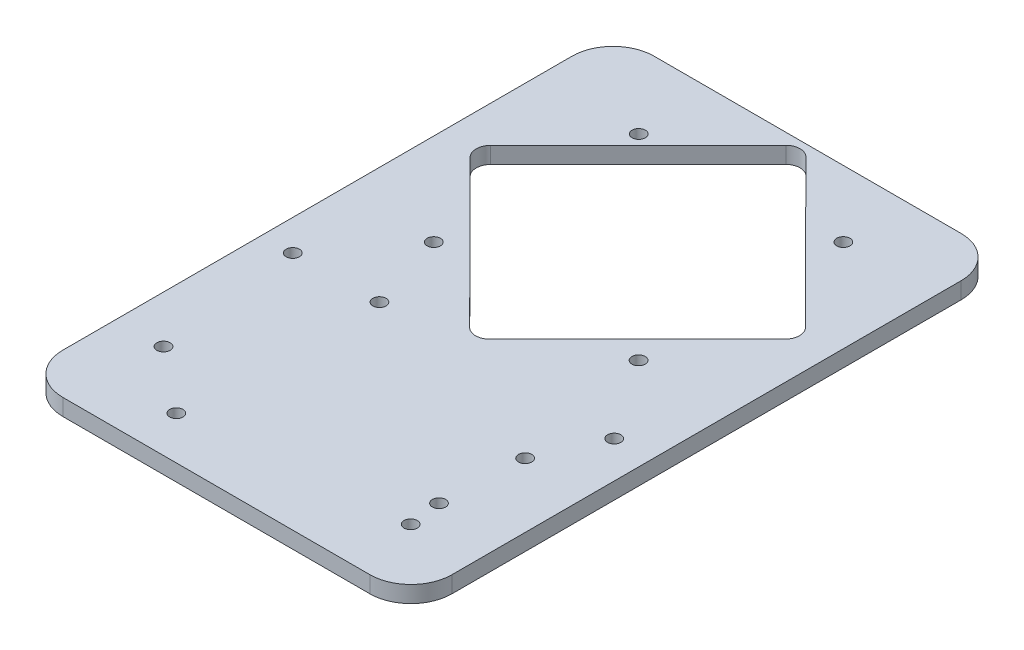
ISO-10303-21;
HEADER;
FILE_DESCRIPTION(('STEP AP214'),'2;1');
FILE_NAME('part.step','',(''),(''),'','','');
FILE_SCHEMA(('AUTOMOTIVE_DESIGN { 1 0 10303 214 1 1 1 1 }'));
ENDSEC;
DATA;
#1=APPLICATION_CONTEXT('core data for automotive mechanical design processes');
#2=APPLICATION_PROTOCOL_DEFINITION('international standard','automotive_design',2000,#1);
#3=PRODUCT_CONTEXT('',#1,'mechanical');
#4=PRODUCT('Part','Part','',(#3));
#5=PRODUCT_RELATED_PRODUCT_CATEGORY('part','',(#4));
#6=PRODUCT_DEFINITION_FORMATION('','',#4);
#7=PRODUCT_DEFINITION_CONTEXT('part definition',#1,'design');
#8=PRODUCT_DEFINITION('design','',#6,#7);
#9=PRODUCT_DEFINITION_SHAPE('','',#8);
#10=(LENGTH_UNIT() NAMED_UNIT(*) SI_UNIT(.MILLI.,.METRE.));
#11=(NAMED_UNIT(*) PLANE_ANGLE_UNIT() SI_UNIT($,.RADIAN.));
#12=(NAMED_UNIT(*) SI_UNIT($,.STERADIAN.) SOLID_ANGLE_UNIT());
#13=UNCERTAINTY_MEASURE_WITH_UNIT(LENGTH_MEASURE(1.E-05),#10,'distance_accuracy_value','');
#14=(GEOMETRIC_REPRESENTATION_CONTEXT(3) GLOBAL_UNCERTAINTY_ASSIGNED_CONTEXT((#13)) GLOBAL_UNIT_ASSIGNED_CONTEXT((#10,
#11,#12)) REPRESENTATION_CONTEXT('',''));
#15=CARTESIAN_POINT('',(0.,0.,0.));
#16=DIRECTION('',(0.,0.,1.));
#17=DIRECTION('',(1.,0.,0.));
#18=AXIS2_PLACEMENT_3D('',#15,#16,#17);
#19=CARTESIAN_POINT('',(-175.915621646314,3.175,-37.3564917154087));
#20=DIRECTION('',(0.,-1.,0.));
#21=DIRECTION('',(0.,0.,-1.));
#22=AXIS2_PLACEMENT_3D('',#19,#20,#21);
#23=CYLINDRICAL_SURFACE('',#22,7.83748327348363);
#24=CARTESIAN_POINT('',(-175.915621646314,0.,-37.3564917154087));
#25=DIRECTION('',(0.,1.,0.));
#26=DIRECTION('',(0.,0.,1.));
#27=AXIS2_PLACEMENT_3D('',#24,#25,#26);
#28=CIRCLE('',#27,7.83748327348363);
#29=CARTESIAN_POINT('',(-175.915621646314,0.,-29.5190084419251));
#30=VERTEX_POINT('',#29);
#31=CARTESIAN_POINT('',(-183.753097882009,0.,-37.3669949082031));
#32=VERTEX_POINT('',#31);
#33=EDGE_CURVE('E242',#30,#32,#28,.F.);
#34=ORIENTED_EDGE('',*,*,#33,.F.);
#35=DIRECTION('',(0.,-1.,0.));
#36=VECTOR('',#35,1.);
#37=CARTESIAN_POINT('',(-175.915621646314,3.175,-29.5190084419251));
#38=LINE('',#37,#36);
#39=CARTESIAN_POINT('',(-175.915621646314,3.175,-29.5190084419251));
#40=VERTEX_POINT('',#39);
#41=EDGE_CURVE('E11',#40,#30,#38,.T.);
#42=ORIENTED_EDGE('',*,*,#41,.F.);
#43=CARTESIAN_POINT('',(-175.915621646314,3.175,-37.3564917154087));
#44=DIRECTION('',(0.,1.,0.));
#45=DIRECTION('',(0.,0.,1.));
#46=AXIS2_PLACEMENT_3D('',#43,#44,#45);
#47=CIRCLE('',#46,7.83748327348363);
#48=CARTESIAN_POINT('',(-183.753097882009,3.175,-37.3669949082031));
#49=VERTEX_POINT('',#48);
#50=EDGE_CURVE('E323',#40,#49,#47,.F.);
#51=ORIENTED_EDGE('',*,*,#50,.T.);
#52=DIRECTION('',(0.,-1.,0.));
#53=VECTOR('',#52,1.);
#54=CARTESIAN_POINT('',(-183.753097882009,3.175,-37.3669949082031));
#55=LINE('',#54,#53);
#56=EDGE_CURVE('E110',#49,#32,#55,.T.);
#57=ORIENTED_EDGE('',*,*,#56,.T.);
#58=EDGE_LOOP('',(#34,#42,#51,#57));
#59=FACE_BOUND('',#58,.T.);
#60=ADVANCED_FACE('F33',(#59),#23,.T.);
#61=CARTESIAN_POINT('',(0.,3.175,-29.5190084419251));
#62=DIRECTION('',(0.,0.,-1.));
#63=DIRECTION('',(-1.,0.,0.));
#64=AXIS2_PLACEMENT_3D('',#61,#62,#63);
#65=PLANE('',#64);
#66=DIRECTION('',(1.,0.,0.));
#67=VECTOR('',#66,1.);
#68=CARTESIAN_POINT('',(0.,0.,-29.5190084419251));
#69=LINE('',#68,#67);
#70=CARTESIAN_POINT('',(-117.149118786488,0.,-29.5190084419251));
#71=VERTEX_POINT('',#70);
#72=EDGE_CURVE('E245',#30,#71,#69,.T.);
#73=ORIENTED_EDGE('',*,*,#72,.T.);
#74=DIRECTION('',(0.,-1.,0.));
#75=VECTOR('',#74,1.);
#76=CARTESIAN_POINT('',(-117.149118786488,3.175,-29.5190084419251));
#77=LINE('',#76,#75);
#78=CARTESIAN_POINT('',(-117.149118786488,3.175,-29.5190084419251));
#79=VERTEX_POINT('',#78);
#80=EDGE_CURVE('E43',#79,#71,#77,.T.);
#81=ORIENTED_EDGE('',*,*,#80,.F.);
#82=DIRECTION('',(1.,0.,0.));
#83=VECTOR('',#82,1.);
#84=CARTESIAN_POINT('',(0.,3.175,-29.5190084419251));
#85=LINE('',#84,#83);
#86=EDGE_CURVE('E325',#40,#79,#85,.T.);
#87=ORIENTED_EDGE('',*,*,#86,.F.);
#88=ORIENTED_EDGE('',*,*,#41,.T.);
#89=EDGE_LOOP('',(#73,#81,#87,#88));
#90=FACE_BOUND('',#89,.T.);
#91=ADVANCED_FACE('F342',(#90),#65,.F.);
#92=CARTESIAN_POINT('',(-117.149118786488,3.175,-37.3705371886915));
#93=DIRECTION('',(0.,-1.,0.));
#94=DIRECTION('',(0.,0.,-1.));
#95=AXIS2_PLACEMENT_3D('',#92,#93,#94);
#96=CYLINDRICAL_SURFACE('',#95,7.85152874676642);
#97=CARTESIAN_POINT('',(-117.149118786488,0.,-37.3705371886915));
#98=DIRECTION('',(0.,1.,0.));
#99=DIRECTION('',(0.,0.,1.));
#100=AXIS2_PLACEMENT_3D('',#97,#98,#99);
#101=CIRCLE('',#100,7.85152874676642);
#102=CARTESIAN_POINT('',(-109.297590039721,0.,-37.3705371898592));
#103=VERTEX_POINT('',#102);
#104=EDGE_CURVE('E248',#103,#71,#101,.F.);
#105=ORIENTED_EDGE('',*,*,#104,.F.);
#106=DIRECTION('',(0.,-1.,0.));
#107=VECTOR('',#106,1.);
#108=CARTESIAN_POINT('',(-109.297590039721,3.175,-37.3705371898592));
#109=LINE('',#108,#107);
#110=CARTESIAN_POINT('',(-109.297590039721,3.175,-37.3705371898592));
#111=VERTEX_POINT('',#110);
#112=EDGE_CURVE('E268',#111,#103,#109,.T.);
#113=ORIENTED_EDGE('',*,*,#112,.F.);
#114=CARTESIAN_POINT('',(-117.149118786488,3.175,-37.3705371886915));
#115=DIRECTION('',(0.,1.,0.));
#116=DIRECTION('',(0.,0.,1.));
#117=AXIS2_PLACEMENT_3D('',#114,#115,#116);
#118=CIRCLE('',#117,7.85152874676642);
#119=EDGE_CURVE('E327',#111,#79,#118,.F.);
#120=ORIENTED_EDGE('',*,*,#119,.T.);
#121=ORIENTED_EDGE('',*,*,#80,.T.);
#122=EDGE_LOOP('',(#105,#113,#120,#121));
#123=FACE_BOUND('',#122,.T.);
#124=ADVANCED_FACE('F345',(#123),#96,.T.);
#125=CARTESIAN_POINT('',(-109.297590039721,3.175,0.));
#126=DIRECTION('',(1.,0.,0.));
#127=DIRECTION('',(0.,0.,-1.));
#128=AXIS2_PLACEMENT_3D('',#125,#126,#127);
#129=PLANE('',#128);
#130=DIRECTION('',(0.,0.,1.));
#131=VECTOR('',#130,1.);
#132=CARTESIAN_POINT('',(-109.297590039721,0.,0.));
#133=LINE('',#132,#131);
#134=CARTESIAN_POINT('',(-109.297590039721,0.,-134.809230866446));
#135=VERTEX_POINT('',#134);
#136=EDGE_CURVE('E251',#135,#103,#133,.T.);
#137=ORIENTED_EDGE('',*,*,#136,.F.);
#138=DIRECTION('',(0.,-1.,0.));
#139=VECTOR('',#138,1.);
#140=CARTESIAN_POINT('',(-109.297590039721,3.175,-134.809230866446));
#141=LINE('',#140,#139);
#142=CARTESIAN_POINT('',(-109.297590039721,3.175,-134.809230866446));
#143=VERTEX_POINT('',#142);
#144=EDGE_CURVE('E266',#143,#135,#141,.T.);
#145=ORIENTED_EDGE('',*,*,#144,.F.);
#146=DIRECTION('',(0.,0.,1.));
#147=VECTOR('',#146,1.);
#148=CARTESIAN_POINT('',(-109.297590039721,3.175,0.));
#149=LINE('',#148,#147);
#150=EDGE_CURVE('E330',#143,#111,#149,.T.);
#151=ORIENTED_EDGE('',*,*,#150,.T.);
#152=ORIENTED_EDGE('',*,*,#112,.T.);
#153=EDGE_LOOP('',(#137,#145,#151,#152));
#154=FACE_BOUND('',#153,.T.);
#155=ADVANCED_FACE('F347',(#154),#129,.T.);
#156=CARTESIAN_POINT('',(-117.135014527646,3.175,-134.823325120383));
#157=DIRECTION('',(0.,-1.,0.));
#158=DIRECTION('',(0.,0.,-1.));
#159=AXIS2_PLACEMENT_3D('',#156,#157,#158);
#160=CYLINDRICAL_SURFACE('',#159,7.8374371609547);
#161=CARTESIAN_POINT('',(-117.135014527646,0.,-134.823325120383));
#162=DIRECTION('',(0.,1.,0.));
#163=DIRECTION('',(0.,0.,1.));
#164=AXIS2_PLACEMENT_3D('',#161,#162,#163);
#165=CIRCLE('',#164,7.8374371609547);
#166=CARTESIAN_POINT('',(-117.135020463381,0.,-142.660762281336));
#167=VERTEX_POINT('',#166);
#168=EDGE_CURVE('E254',#167,#135,#165,.F.);
#169=ORIENTED_EDGE('',*,*,#168,.F.);
#170=DIRECTION('',(0.,-1.,0.));
#171=VECTOR('',#170,1.);
#172=CARTESIAN_POINT('',(-117.135020463381,3.175,-142.660762281336));
#173=LINE('',#172,#171);
#174=CARTESIAN_POINT('',(-117.135020463381,3.175,-142.660762281336));
#175=VERTEX_POINT('',#174);
#176=EDGE_CURVE('E167',#175,#167,#173,.T.);
#177=ORIENTED_EDGE('',*,*,#176,.F.);
#178=CARTESIAN_POINT('',(-117.135014527646,3.175,-134.823325120383));
#179=DIRECTION('',(0.,1.,0.));
#180=DIRECTION('',(0.,0.,1.));
#181=AXIS2_PLACEMENT_3D('',#178,#179,#180);
#182=CIRCLE('',#181,7.8374371609547);
#183=EDGE_CURVE('E174',#175,#143,#182,.F.);
#184=ORIENTED_EDGE('',*,*,#183,.T.);
#185=ORIENTED_EDGE('',*,*,#144,.T.);
#186=EDGE_LOOP('',(#169,#177,#184,#185));
#187=FACE_BOUND('',#186,.T.);
#188=ADVANCED_FACE('F334',(#187),#160,.T.);
#189=CARTESIAN_POINT('',(-0.00896978724063926,3.175,-142.668126194937));
#190=DIRECTION('',(-6.28716971487741E-05,0.,-0.999999998023575));
#191=DIRECTION('',(-0.999999998023575,0.,6.28716971487741E-05));
#192=AXIS2_PLACEMENT_3D('',#189,#190,#191);
#193=PLANE('',#192);
#194=DIRECTION('',(0.999999998023575,0.,-6.28716971487741E-05));
#195=VECTOR('',#194,1.);
#196=CARTESIAN_POINT('',(-0.00896978724063926,0.,-142.668126194937));
#197=LINE('',#196,#195);
#198=CARTESIAN_POINT('',(-175.915627469536,0.,-142.657066644807));
#199=VERTEX_POINT('',#198);
#200=EDGE_CURVE('E162',#199,#167,#197,.T.);
#201=ORIENTED_EDGE('',*,*,#200,.F.);
#202=DIRECTION('',(0.,-1.,0.));
#203=VECTOR('',#202,1.);
#204=CARTESIAN_POINT('',(-175.915627469536,3.175,-142.657066644807));
#205=LINE('',#204,#203);
#206=CARTESIAN_POINT('',(-175.915627469536,3.175,-142.657066644807));
#207=VERTEX_POINT('',#206);
#208=EDGE_CURVE('E157',#207,#199,#205,.T.);
#209=ORIENTED_EDGE('',*,*,#208,.F.);
#210=DIRECTION('',(0.999999998023575,0.,-6.28716971487741E-05));
#211=VECTOR('',#210,1.);
#212=CARTESIAN_POINT('',(-0.00896978724063926,3.175,-142.668126194937));
#213=LINE('',#212,#211);
#214=EDGE_CURVE('E160',#207,#175,#213,.T.);
#215=ORIENTED_EDGE('',*,*,#214,.T.);
#216=ORIENTED_EDGE('',*,*,#176,.T.);
#217=EDGE_LOOP('',(#201,#209,#215,#216));
#218=FACE_BOUND('',#217,.T.);
#219=ADVANCED_FACE('F159',(#218),#193,.T.);
#220=CARTESIAN_POINT('',(-175.901553851924,3.175,-134.805535227965));
#221=DIRECTION('',(0.,-1.,0.));
#222=DIRECTION('',(0.,0.,-1.));
#223=AXIS2_PLACEMENT_3D('',#220,#221,#222);
#224=CYLINDRICAL_SURFACE('',#223,7.85154403008495);
#225=CARTESIAN_POINT('',(-175.901553851924,0.,-134.805535227965));
#226=DIRECTION('',(0.,1.,0.));
#227=DIRECTION('',(0.,0.,1.));
#228=AXIS2_PLACEMENT_3D('',#225,#226,#227);
#229=CIRCLE('',#228,7.85154403008495);
#230=CARTESIAN_POINT('',(-183.753097882009,0.,-134.805535227965));
#231=VERTEX_POINT('',#230);
#232=EDGE_CURVE('E258',#231,#199,#229,.F.);
#233=ORIENTED_EDGE('',*,*,#232,.F.);
#234=DIRECTION('',(0.,-1.,0.));
#235=VECTOR('',#234,1.);
#236=CARTESIAN_POINT('',(-183.753097882009,3.175,-134.805535227965));
#237=LINE('',#236,#235);
#238=CARTESIAN_POINT('',(-183.753097882009,3.175,-134.805535227965));
#239=VERTEX_POINT('',#238);
#240=EDGE_CURVE('E103',#239,#231,#237,.T.);
#241=ORIENTED_EDGE('',*,*,#240,.F.);
#242=CARTESIAN_POINT('',(-175.901553851924,3.175,-134.805535227965));
#243=DIRECTION('',(0.,1.,0.));
#244=DIRECTION('',(0.,0.,1.));
#245=AXIS2_PLACEMENT_3D('',#242,#243,#244);
#246=CIRCLE('',#245,7.85154403008495);
#247=EDGE_CURVE('E171',#239,#207,#246,.F.);
#248=ORIENTED_EDGE('',*,*,#247,.T.);
#249=ORIENTED_EDGE('',*,*,#208,.T.);
#250=EDGE_LOOP('',(#233,#241,#248,#249));
#251=FACE_BOUND('',#250,.T.);
#252=ADVANCED_FACE('F176',(#251),#224,.T.);
#253=CARTESIAN_POINT('',(-146.606780114926,3.175,-138.56908439217));
#254=DIRECTION('',(0.,-1.,0.));
#255=DIRECTION('',(0.,0.,-1.));
#256=AXIS2_PLACEMENT_3D('',#253,#254,#255);
#257=CYLINDRICAL_SURFACE('',#256,2.72133964134664);
#258=CARTESIAN_POINT('',(-146.606780114926,0.,-138.56908439217));
#259=DIRECTION('',(0.,1.,0.));
#260=DIRECTION('',(0.,0.,1.));
#261=AXIS2_PLACEMENT_3D('',#258,#259,#260);
#262=CIRCLE('',#261,2.72133964134664);
#263=CARTESIAN_POINT('',(-144.6795707612,0.,-140.490425993884));
#264=VERTEX_POINT('',#263);
#265=CARTESIAN_POINT('',(-148.531606371105,0.,-140.492813408192));
#266=VERTEX_POINT('',#265);
#267=EDGE_CURVE('E218',#264,#266,#262,.T.);
#268=ORIENTED_EDGE('',*,*,#267,.F.);
#269=DIRECTION('',(0.,-1.,0.));
#270=VECTOR('',#269,1.);
#271=CARTESIAN_POINT('',(-144.6795707612,3.175,-140.490425993884));
#272=LINE('',#271,#270);
#273=CARTESIAN_POINT('',(-144.6795707612,3.175,-140.490425993884));
#274=VERTEX_POINT('',#273);
#275=EDGE_CURVE('E37',#274,#264,#272,.T.);
#276=ORIENTED_EDGE('',*,*,#275,.F.);
#277=CARTESIAN_POINT('',(-146.606780114926,3.175,-138.56908439217));
#278=DIRECTION('',(0.,1.,0.));
#279=DIRECTION('',(0.,0.,1.));
#280=AXIS2_PLACEMENT_3D('',#277,#278,#279);
#281=CIRCLE('',#280,2.72133964134664);
#282=CARTESIAN_POINT('',(-148.531606371105,3.175,-140.492813408192));
#283=VERTEX_POINT('',#282);
#284=EDGE_CURVE('E700',#274,#283,#281,.T.);
#285=ORIENTED_EDGE('',*,*,#284,.T.);
#286=DIRECTION('',(0.,-1.,0.));
#287=VECTOR('',#286,1.);
#288=CARTESIAN_POINT('',(-148.531606371105,3.175,-140.492813408192));
#289=LINE('',#288,#287);
#290=EDGE_CURVE('E178',#283,#266,#289,.T.);
#291=ORIENTED_EDGE('',*,*,#290,.T.);
#292=EDGE_LOOP('',(#268,#276,#285,#291));
#293=FACE_BOUND('',#292,.T.);
#294=ADVANCED_FACE('F291',(#293),#257,.F.);
#295=CARTESIAN_POINT('',(-2.31548637270239,3.175,2.30843643814548));
#296=DIRECTION('',(-0.708184059220174,0.,0.706027859412387));
#297=DIRECTION('',(0.706027859412387,0.,0.708184059220174));
#298=AXIS2_PLACEMENT_3D('',#295,#296,#297);
#299=PLANE('',#298);
#300=DIRECTION('',(-0.706027859412387,0.,-0.708184059220174));
#301=VECTOR('',#300,1.);
#302=CARTESIAN_POINT('',(-2.31548637270239,0.,2.30843643814548));
#303=LINE('',#302,#301);
#304=CARTESIAN_POINT('',(-116.447583057877,0.,-112.172218170989));
#305=VERTEX_POINT('',#304);
#306=EDGE_CURVE('E221',#305,#264,#303,.T.);
#307=ORIENTED_EDGE('',*,*,#306,.F.);
#308=DIRECTION('',(0.,-1.,0.));
#309=VECTOR('',#308,1.);
#310=CARTESIAN_POINT('',(-116.447583057877,3.175,-112.172218170989));
#311=LINE('',#310,#309);
#312=CARTESIAN_POINT('',(-116.447583057877,3.175,-112.172218170989));
#313=VERTEX_POINT('',#312);
#314=EDGE_CURVE('E281',#313,#305,#311,.T.);
#315=ORIENTED_EDGE('',*,*,#314,.F.);
#316=DIRECTION('',(-0.706027859412387,0.,-0.708184059220174));
#317=VECTOR('',#316,1.);
#318=CARTESIAN_POINT('',(-2.31548637270239,3.175,2.30843643814548));
#319=LINE('',#318,#317);
#320=EDGE_CURVE('E290',#313,#274,#319,.T.);
#321=ORIENTED_EDGE('',*,*,#320,.T.);
#322=ORIENTED_EDGE('',*,*,#275,.T.);
#323=EDGE_LOOP('',(#307,#315,#321,#322));
#324=FACE_BOUND('',#323,.T.);
#325=ADVANCED_FACE('F288',(#324),#299,.T.);
#326=CARTESIAN_POINT('',(-118.381866967214,3.175,-110.243823553481));
#327=DIRECTION('',(0.,-1.,0.));
#328=DIRECTION('',(0.,0.,-1.));
#329=AXIS2_PLACEMENT_3D('',#326,#327,#328);
#330=CYLINDRICAL_SURFACE('',#329,2.73132935450001);
#331=CARTESIAN_POINT('',(-118.381866967214,0.,-110.243823553481));
#332=DIRECTION('',(0.,1.,0.));
#333=DIRECTION('',(0.,0.,1.));
#334=AXIS2_PLACEMENT_3D('',#331,#332,#333);
#335=CIRCLE('',#334,2.73132935450001);
#336=CARTESIAN_POINT('',(-116.449969407192,0.,-108.3130382572));
#337=VERTEX_POINT('',#336);
#338=EDGE_CURVE('E224',#337,#305,#335,.T.);
#339=ORIENTED_EDGE('',*,*,#338,.F.);
#340=DIRECTION('',(0.,-1.,0.));
#341=VECTOR('',#340,1.);
#342=CARTESIAN_POINT('',(-116.449969407192,3.175,-108.3130382572));
#343=LINE('',#342,#341);
#344=CARTESIAN_POINT('',(-116.449969407192,3.175,-108.3130382572));
#345=VERTEX_POINT('',#344);
#346=EDGE_CURVE('E280',#345,#337,#343,.T.);
#347=ORIENTED_EDGE('',*,*,#346,.F.);
#348=CARTESIAN_POINT('',(-118.381866967214,3.175,-110.243823553481));
#349=DIRECTION('',(0.,1.,0.));
#350=DIRECTION('',(0.,0.,1.));
#351=AXIS2_PLACEMENT_3D('',#348,#349,#350);
#352=CIRCLE('',#351,2.73132935450001);
#353=EDGE_CURVE('E300',#345,#313,#352,.T.);
#354=ORIENTED_EDGE('',*,*,#353,.T.);
#355=ORIENTED_EDGE('',*,*,#314,.T.);
#356=EDGE_LOOP('',(#339,#347,#354,#355));
#357=FACE_BOUND('',#356,.T.);
#358=ADVANCED_FACE('F298',(#357),#330,.F.);
#359=CARTESIAN_POINT('',(-112.415026744206,3.175,-112.350305321778));
#360=DIRECTION('',(-0.707310364031529,0.,-0.706903139711223));
#361=DIRECTION('',(-0.706903139711223,0.,0.707310364031529));
#362=AXIS2_PLACEMENT_3D('',#359,#360,#361);
#363=PLANE('',#362);
#364=DIRECTION('',(0.706903139711223,0.,-0.707310364031529));
#365=VECTOR('',#364,1.);
#366=CARTESIAN_POINT('',(-112.415026744206,0.,-112.350305321778));
#367=LINE('',#366,#365);
#368=CARTESIAN_POINT('',(-144.71682032001,0.,-80.0299037144143));
#369=VERTEX_POINT('',#368);
#370=EDGE_CURVE('E227',#369,#337,#367,.T.);
#371=ORIENTED_EDGE('',*,*,#370,.F.);
#372=DIRECTION('',(0.,-1.,0.));
#373=VECTOR('',#372,1.);
#374=CARTESIAN_POINT('',(-144.71682032001,3.175,-80.0299037144143));
#375=LINE('',#374,#373);
#376=CARTESIAN_POINT('',(-144.71682032001,3.175,-80.0299037144143));
#377=VERTEX_POINT('',#376);
#378=EDGE_CURVE('E278',#377,#369,#375,.T.);
#379=ORIENTED_EDGE('',*,*,#378,.F.);
#380=DIRECTION('',(0.706903139711223,0.,-0.707310364031529));
#381=VECTOR('',#380,1.);
#382=CARTESIAN_POINT('',(-112.415026744206,3.175,-112.350305321778));
#383=LINE('',#382,#381);
#384=EDGE_CURVE('E306',#377,#345,#383,.T.);
#385=ORIENTED_EDGE('',*,*,#384,.T.);
#386=ORIENTED_EDGE('',*,*,#346,.T.);
#387=EDGE_LOOP('',(#371,#379,#385,#386));
#388=FACE_BOUND('',#387,.T.);
#389=ADVANCED_FACE('F309',(#388),#363,.T.);
#390=CARTESIAN_POINT('',(-146.64180477245,3.175,-81.9537798832422));
#391=DIRECTION('',(0.,-1.,0.));
#392=DIRECTION('',(0.,0.,-1.));
#393=AXIS2_PLACEMENT_3D('',#390,#391,#392);
#394=CYLINDRICAL_SURFACE('',#393,2.72155555797046);
#395=CARTESIAN_POINT('',(-146.64180477245,0.,-81.9537798832422));
#396=DIRECTION('',(0.,1.,0.));
#397=DIRECTION('',(0.,0.,1.));
#398=AXIS2_PLACEMENT_3D('',#395,#396,#397);
#399=CIRCLE('',#398,2.72155555797046);
#400=CARTESIAN_POINT('',(-148.569167295676,0.,-80.0322860999622));
#401=VERTEX_POINT('',#400);
#402=EDGE_CURVE('E230',#401,#369,#399,.T.);
#403=ORIENTED_EDGE('',*,*,#402,.F.);
#404=DIRECTION('',(0.,-1.,0.));
#405=VECTOR('',#404,1.);
#406=CARTESIAN_POINT('',(-148.569167295676,3.175,-80.0322860999622));
#407=LINE('',#406,#405);
#408=CARTESIAN_POINT('',(-148.569167295676,3.175,-80.0322860999622));
#409=VERTEX_POINT('',#408);
#410=EDGE_CURVE('E276',#409,#401,#407,.T.);
#411=ORIENTED_EDGE('',*,*,#410,.F.);
#412=CARTESIAN_POINT('',(-146.64180477245,3.175,-81.9537798832422));
#413=DIRECTION('',(0.,1.,0.));
#414=DIRECTION('',(0.,0.,1.));
#415=AXIS2_PLACEMENT_3D('',#412,#413,#414);
#416=CIRCLE('',#415,2.72155555797046);
#417=EDGE_CURVE('E310',#409,#377,#416,.T.);
#418=ORIENTED_EDGE('',*,*,#417,.T.);
#419=ORIENTED_EDGE('',*,*,#378,.T.);
#420=EDGE_LOOP('',(#403,#411,#418,#419));
#421=FACE_BOUND('',#420,.T.);
#422=ADVANCED_FACE('F375',(#421),#394,.F.);
#423=CARTESIAN_POINT('',(-34.4951645621356,3.175,34.3901281988292));
#424=DIRECTION('',(0.708184155043798,0.,-0.706027763296106));
#425=DIRECTION('',(-0.706027763296106,0.,-0.708184155043798));
#426=AXIS2_PLACEMENT_3D('',#423,#424,#425);
#427=PLANE('',#426);
#428=DIRECTION('',(0.706027763296106,0.,0.708184155043798));
#429=VECTOR('',#428,1.);
#430=CARTESIAN_POINT('',(-34.4951645621356,0.,34.3901281988292));
#431=LINE('',#430,#429);
#432=CARTESIAN_POINT('',(-176.801172002401,0.,-108.350518665045));
#433=VERTEX_POINT('',#432);
#434=EDGE_CURVE('E233',#433,#401,#431,.T.);
#435=ORIENTED_EDGE('',*,*,#434,.F.);
#436=DIRECTION('',(0.,-1.,0.));
#437=VECTOR('',#436,1.);
#438=CARTESIAN_POINT('',(-176.801172002401,3.175,-108.350518665045));
#439=LINE('',#438,#437);
#440=CARTESIAN_POINT('',(-176.801172002401,3.175,-108.350518665045));
#441=VERTEX_POINT('',#440);
#442=EDGE_CURVE('E274',#441,#433,#439,.T.);
#443=ORIENTED_EDGE('',*,*,#442,.F.);
#444=DIRECTION('',(0.706027763296106,0.,0.708184155043798));
#445=VECTOR('',#444,1.);
#446=CARTESIAN_POINT('',(-34.4951645621356,3.175,34.3901281988292));
#447=LINE('',#446,#445);
#448=EDGE_CURVE('E312',#441,#409,#447,.T.);
#449=ORIENTED_EDGE('',*,*,#448,.T.);
#450=ORIENTED_EDGE('',*,*,#410,.T.);
#451=EDGE_LOOP('',(#435,#443,#449,#450));
#452=FACE_BOUND('',#451,.T.);
#453=ADVANCED_FACE('F371',(#452),#427,.T.);
#454=CARTESIAN_POINT('',(-174.734146036219,3.175,-110.278731672357));
#455=DIRECTION('',(0.,-1.,0.));
#456=DIRECTION('',(0.,0.,-1.));
#457=AXIS2_PLACEMENT_3D('',#454,#455,#456);
#458=CYLINDRICAL_SURFACE('',#457,2.82676524430922);
#459=CARTESIAN_POINT('',(-174.734146036219,0.,-110.278731672357));
#460=DIRECTION('',(0.,1.,0.));
#461=DIRECTION('',(0.,0.,1.));
#462=AXIS2_PLACEMENT_3D('',#459,#460,#461);
#463=CIRCLE('',#462,2.82676524430922);
#464=CARTESIAN_POINT('',(-176.798615574899,0.,-112.209681508655));
#465=VERTEX_POINT('',#464);
#466=EDGE_CURVE('E236',#465,#433,#463,.T.);
#467=ORIENTED_EDGE('',*,*,#466,.F.);
#468=DIRECTION('',(0.,-1.,0.));
#469=VECTOR('',#468,1.);
#470=CARTESIAN_POINT('',(-176.798615574899,3.175,-112.209681508655));
#471=LINE('',#470,#469);
#472=CARTESIAN_POINT('',(-176.798615574899,3.175,-112.209681508655));
#473=VERTEX_POINT('',#472);
#474=EDGE_CURVE('E272',#473,#465,#471,.T.);
#475=ORIENTED_EDGE('',*,*,#474,.F.);
#476=CARTESIAN_POINT('',(-174.734146036219,3.175,-110.278731672357));
#477=DIRECTION('',(0.,1.,0.));
#478=DIRECTION('',(0.,0.,1.));
#479=AXIS2_PLACEMENT_3D('',#476,#477,#478);
#480=CIRCLE('',#479,2.82676524430922);
#481=EDGE_CURVE('E318',#473,#441,#480,.T.);
#482=ORIENTED_EDGE('',*,*,#481,.T.);
#483=ORIENTED_EDGE('',*,*,#442,.T.);
#484=EDGE_LOOP('',(#467,#475,#482,#483));
#485=FACE_BOUND('',#484,.T.);
#486=ADVANCED_FACE('F367',(#485),#458,.F.);
#487=CARTESIAN_POINT('',(-144.55454548528,3.175,-144.472142696102));
#488=DIRECTION('',(-0.707308351715706,0.,-0.706905153180546));
#489=DIRECTION('',(-0.706905153180546,0.,0.707308351715706));
#490=AXIS2_PLACEMENT_3D('',#487,#488,#489);
#491=PLANE('',#490);
#492=DIRECTION('',(0.706905153180546,0.,-0.707308351715706));
#493=VECTOR('',#492,1.);
#494=CARTESIAN_POINT('',(-144.55454548528,0.,-144.472142696102));
#495=LINE('',#494,#493);
#496=EDGE_CURVE('E239',#465,#266,#495,.T.);
#497=ORIENTED_EDGE('',*,*,#496,.T.);
#498=ORIENTED_EDGE('',*,*,#290,.F.);
#499=DIRECTION('',(0.706905153180546,0.,-0.707308351715706));
#500=VECTOR('',#499,1.);
#501=CARTESIAN_POINT('',(-144.55454548528,3.175,-144.472142696102));
#502=LINE('',#501,#500);
#503=EDGE_CURVE('E321',#473,#283,#502,.T.);
#504=ORIENTED_EDGE('',*,*,#503,.F.);
#505=ORIENTED_EDGE('',*,*,#474,.T.);
#506=EDGE_LOOP('',(#497,#498,#504,#505));
#507=FACE_BOUND('',#506,.T.);
#508=ADVANCED_FACE('F363',(#507),#491,.F.);
#509=CARTESIAN_POINT('',(-162.435290361079,3.175,-37.7631536330528));
#510=DIRECTION('',(0.,-1.,0.));
#511=DIRECTION('',(0.,0.,-1.));
#512=AXIS2_PLACEMENT_3D('',#509,#510,#511);
#513=CYLINDRICAL_SURFACE('',#512,1.27);
#514=CARTESIAN_POINT('',(-162.435290361079,3.175,-37.7631536330528));
#515=DIRECTION('',(0.,1.,0.));
#516=DIRECTION('',(0.,0.,1.));
#517=AXIS2_PLACEMENT_3D('',#514,#515,#516);
#518=CIRCLE('',#517,1.27);
#519=CARTESIAN_POINT('',(-162.435290361079,3.175,-36.4931536330528));
#520=VERTEX_POINT('',#519);
#521=EDGE_CURVE('E699',#520,#520,#518,.T.);
#522=ORIENTED_EDGE('',*,*,#521,.T.);
#523=EDGE_LOOP('',(#522));
#524=FACE_BOUND('',#523,.T.);
#525=CARTESIAN_POINT('',(-162.435290361079,0.,-37.7631536330528));
#526=DIRECTION('',(0.,1.,0.));
#527=DIRECTION('',(0.,0.,1.));
#528=AXIS2_PLACEMENT_3D('',#525,#526,#527);
#529=CIRCLE('',#528,1.27);
#530=CARTESIAN_POINT('',(-162.435290361079,0.,-36.4931536330528));
#531=VERTEX_POINT('',#530);
#532=EDGE_CURVE('E215',#531,#531,#529,.T.);
#533=ORIENTED_EDGE('',*,*,#532,.F.);
#534=EDGE_LOOP('',(#533));
#535=FACE_BOUND('',#534,.T.);
#536=ADVANCED_FACE('F366',(#524,#535),#513,.F.);
#537=CARTESIAN_POINT('',(-121.602318574068,3.175,-41.7674303586459));
#538=DIRECTION('',(0.,-1.,0.));
#539=DIRECTION('',(0.,0.,-1.));
#540=AXIS2_PLACEMENT_3D('',#537,#538,#539);
#541=CYLINDRICAL_SURFACE('',#540,1.26999999999999);
#542=CARTESIAN_POINT('',(-121.602318574068,3.175,-41.7674303586459));
#543=DIRECTION('',(0.,1.,0.));
#544=DIRECTION('',(0.,0.,1.));
#545=AXIS2_PLACEMENT_3D('',#542,#543,#544);
#546=CIRCLE('',#545,1.26999999999999);
#547=CARTESIAN_POINT('',(-121.602318574068,3.175,-40.4974303586459));
#548=VERTEX_POINT('',#547);
#549=EDGE_CURVE('E696',#548,#548,#546,.T.);
#550=ORIENTED_EDGE('',*,*,#549,.T.);
#551=EDGE_LOOP('',(#550));
#552=FACE_BOUND('',#551,.T.);
#553=CARTESIAN_POINT('',(-121.602318574068,0.,-41.7674303586459));
#554=DIRECTION('',(0.,1.,0.));
#555=DIRECTION('',(0.,0.,1.));
#556=AXIS2_PLACEMENT_3D('',#553,#554,#555);
#557=CIRCLE('',#556,1.26999999999999);
#558=CARTESIAN_POINT('',(-121.602318574068,0.,-40.4974303586459));
#559=VERTEX_POINT('',#558);
#560=EDGE_CURVE('E212',#559,#559,#557,.T.);
#561=ORIENTED_EDGE('',*,*,#560,.F.);
#562=EDGE_LOOP('',(#561));
#563=FACE_BOUND('',#562,.T.);
#564=ADVANCED_FACE('F390',(#552,#563),#541,.F.);
#565=CARTESIAN_POINT('',(-122.379809256622,3.175,-47.976111583741));
#566=DIRECTION('',(0.,-1.,0.));
#567=DIRECTION('',(0.,0.,-1.));
#568=AXIS2_PLACEMENT_3D('',#565,#566,#567);
#569=CYLINDRICAL_SURFACE('',#568,1.26999999999999);
#570=CARTESIAN_POINT('',(-122.379809256622,3.175,-47.976111583741));
#571=DIRECTION('',(0.,1.,0.));
#572=DIRECTION('',(0.,0.,1.));
#573=AXIS2_PLACEMENT_3D('',#570,#571,#572);
#574=CIRCLE('',#573,1.26999999999999);
#575=CARTESIAN_POINT('',(-122.379809256622,3.175,-46.706111583741));
#576=VERTEX_POINT('',#575);
#577=EDGE_CURVE('E692',#576,#576,#574,.T.);
#578=ORIENTED_EDGE('',*,*,#577,.T.);
#579=EDGE_LOOP('',(#578));
#580=FACE_BOUND('',#579,.T.);
#581=CARTESIAN_POINT('',(-122.379809256622,0.,-47.976111583741));
#582=DIRECTION('',(0.,1.,0.));
#583=DIRECTION('',(0.,0.,1.));
#584=AXIS2_PLACEMENT_3D('',#581,#582,#583);
#585=CIRCLE('',#584,1.26999999999999);
#586=CARTESIAN_POINT('',(-122.379809256622,0.,-46.706111583741));
#587=VERTEX_POINT('',#586);
#588=EDGE_CURVE('E209',#587,#587,#585,.T.);
#589=ORIENTED_EDGE('',*,*,#588,.F.);
#590=EDGE_LOOP('',(#589));
#591=FACE_BOUND('',#590,.T.);
#592=ADVANCED_FACE('F394',(#580,#591),#569,.F.);
#593=CARTESIAN_POINT('',(-174.71812766254,3.175,-47.5835411496409));
#594=DIRECTION('',(0.,-1.,0.));
#595=DIRECTION('',(0.,0.,-1.));
#596=AXIS2_PLACEMENT_3D('',#593,#594,#595);
#597=CYLINDRICAL_SURFACE('',#596,1.27);
#598=CARTESIAN_POINT('',(-174.71812766254,3.175,-47.5835411496409));
#599=DIRECTION('',(0.,1.,0.));
#600=DIRECTION('',(0.,0.,1.));
#601=AXIS2_PLACEMENT_3D('',#598,#599,#600);
#602=CIRCLE('',#601,1.27);
#603=CARTESIAN_POINT('',(-174.71812766254,3.175,-46.3135411496409));
#604=VERTEX_POINT('',#603);
#605=EDGE_CURVE('E688',#604,#604,#602,.T.);
#606=ORIENTED_EDGE('',*,*,#605,.T.);
#607=EDGE_LOOP('',(#606));
#608=FACE_BOUND('',#607,.T.);
#609=CARTESIAN_POINT('',(-174.71812766254,0.,-47.5835411496409));
#610=DIRECTION('',(0.,1.,0.));
#611=DIRECTION('',(0.,0.,1.));
#612=AXIS2_PLACEMENT_3D('',#609,#610,#611);
#613=CIRCLE('',#612,1.27);
#614=CARTESIAN_POINT('',(-174.71812766254,0.,-46.3135411496409));
#615=VERTEX_POINT('',#614);
#616=EDGE_CURVE('E206',#615,#615,#613,.T.);
#617=ORIENTED_EDGE('',*,*,#616,.F.);
#618=EDGE_LOOP('',(#617));
#619=FACE_BOUND('',#618,.T.);
#620=ADVANCED_FACE('F398',(#608,#619),#597,.F.);
#621=CARTESIAN_POINT('',(-177.85310357978,3.175,-75.4567475794266));
#622=DIRECTION('',(0.,-1.,0.));
#623=DIRECTION('',(0.,0.,-1.));
#624=AXIS2_PLACEMENT_3D('',#621,#622,#623);
#625=CYLINDRICAL_SURFACE('',#624,1.27000000000001);
#626=CARTESIAN_POINT('',(-177.85310357978,3.175,-75.4567475794266));
#627=DIRECTION('',(0.,1.,0.));
#628=DIRECTION('',(0.,0.,1.));
#629=AXIS2_PLACEMENT_3D('',#626,#627,#628);
#630=CIRCLE('',#629,1.27000000000001);
#631=CARTESIAN_POINT('',(-177.85310357978,3.175,-74.1867475794266));
#632=VERTEX_POINT('',#631);
#633=EDGE_CURVE('E684',#632,#632,#630,.T.);
#634=ORIENTED_EDGE('',*,*,#633,.T.);
#635=EDGE_LOOP('',(#634));
#636=FACE_BOUND('',#635,.T.);
#637=CARTESIAN_POINT('',(-177.85310357978,0.,-75.4567475794266));
#638=DIRECTION('',(0.,1.,0.));
#639=DIRECTION('',(0.,0.,1.));
#640=AXIS2_PLACEMENT_3D('',#637,#638,#639);
#641=CIRCLE('',#640,1.27000000000001);
#642=CARTESIAN_POINT('',(-177.85310357978,0.,-74.1867475794266));
#643=VERTEX_POINT('',#642);
#644=EDGE_CURVE('E203',#643,#643,#641,.T.);
#645=ORIENTED_EDGE('',*,*,#644,.F.);
#646=EDGE_LOOP('',(#645));
#647=FACE_BOUND('',#646,.T.);
#648=ADVANCED_FACE('F402',(#636,#647),#625,.F.);
#649=CARTESIAN_POINT('',(-161.416515799065,3.175,-75.6080570778368));
#650=DIRECTION('',(0.,-1.,0.));
#651=DIRECTION('',(0.,0.,-1.));
#652=AXIS2_PLACEMENT_3D('',#649,#650,#651);
#653=CYLINDRICAL_SURFACE('',#652,1.27000000000001);
#654=CARTESIAN_POINT('',(-161.416515799065,3.175,-75.6080570778368));
#655=DIRECTION('',(0.,1.,0.));
#656=DIRECTION('',(0.,0.,1.));
#657=AXIS2_PLACEMENT_3D('',#654,#655,#656);
#658=CIRCLE('',#657,1.27000000000001);
#659=CARTESIAN_POINT('',(-161.416515799065,3.175,-74.3380570778368));
#660=VERTEX_POINT('',#659);
#661=EDGE_CURVE('E680',#660,#660,#658,.T.);
#662=ORIENTED_EDGE('',*,*,#661,.T.);
#663=EDGE_LOOP('',(#662));
#664=FACE_BOUND('',#663,.T.);
#665=CARTESIAN_POINT('',(-161.416515799065,0.,-75.6080570778368));
#666=DIRECTION('',(0.,1.,0.));
#667=DIRECTION('',(0.,0.,1.));
#668=AXIS2_PLACEMENT_3D('',#665,#666,#667);
#669=CIRCLE('',#668,1.27000000000001);
#670=CARTESIAN_POINT('',(-161.416515799065,0.,-74.3380570778368));
#671=VERTEX_POINT('',#670);
#672=EDGE_CURVE('E200',#671,#671,#669,.T.);
#673=ORIENTED_EDGE('',*,*,#672,.F.);
#674=EDGE_LOOP('',(#673));
#675=FACE_BOUND('',#674,.T.);
#676=ADVANCED_FACE('F406',(#664,#675),#653,.F.);
#677=CARTESIAN_POINT('',(-121.602318573085,3.175,-63.6734158644984));
#678=DIRECTION('',(0.,-1.,0.));
#679=DIRECTION('',(0.,0.,-1.));
#680=AXIS2_PLACEMENT_3D('',#677,#678,#679);
#681=CYLINDRICAL_SURFACE('',#680,1.26999999999999);
#682=CARTESIAN_POINT('',(-121.602318573085,3.175,-63.6734158644984));
#683=DIRECTION('',(0.,1.,0.));
#684=DIRECTION('',(0.,0.,1.));
#685=AXIS2_PLACEMENT_3D('',#682,#683,#684);
#686=CIRCLE('',#685,1.26999999999999);
#687=CARTESIAN_POINT('',(-121.602318573085,3.175,-62.4034158644984));
#688=VERTEX_POINT('',#687);
#689=EDGE_CURVE('E676',#688,#688,#686,.T.);
#690=ORIENTED_EDGE('',*,*,#689,.T.);
#691=EDGE_LOOP('',(#690));
#692=FACE_BOUND('',#691,.T.);
#693=CARTESIAN_POINT('',(-121.602318573085,0.,-63.6734158644984));
#694=DIRECTION('',(0.,1.,0.));
#695=DIRECTION('',(0.,0.,1.));
#696=AXIS2_PLACEMENT_3D('',#693,#694,#695);
#697=CIRCLE('',#696,1.26999999999999);
#698=CARTESIAN_POINT('',(-121.602318573085,0.,-62.4034158644984));
#699=VERTEX_POINT('',#698);
#700=EDGE_CURVE('E197',#699,#699,#697,.T.);
#701=ORIENTED_EDGE('',*,*,#700,.F.);
#702=EDGE_LOOP('',(#701));
#703=FACE_BOUND('',#702,.T.);
#704=ADVANCED_FACE('F410',(#692,#703),#681,.F.);
#705=CARTESIAN_POINT('',(-116.329373393836,3.175,-75.4567475766586));
#706=DIRECTION('',(0.,-1.,0.));
#707=DIRECTION('',(0.,0.,-1.));
#708=AXIS2_PLACEMENT_3D('',#705,#706,#707);
#709=CYLINDRICAL_SURFACE('',#708,1.26999999999999);
#710=CARTESIAN_POINT('',(-116.329373393836,3.175,-75.4567475766586));
#711=DIRECTION('',(0.,1.,0.));
#712=DIRECTION('',(0.,0.,1.));
#713=AXIS2_PLACEMENT_3D('',#710,#711,#712);
#714=CIRCLE('',#713,1.26999999999999);
#715=CARTESIAN_POINT('',(-116.329373393836,3.175,-74.1867475766586));
#716=VERTEX_POINT('',#715);
#717=EDGE_CURVE('E672',#716,#716,#714,.T.);
#718=ORIENTED_EDGE('',*,*,#717,.T.);
#719=EDGE_LOOP('',(#718));
#720=FACE_BOUND('',#719,.T.);
#721=CARTESIAN_POINT('',(-116.329373393836,0.,-75.4567475766586));
#722=DIRECTION('',(0.,1.,0.));
#723=DIRECTION('',(0.,0.,1.));
#724=AXIS2_PLACEMENT_3D('',#721,#722,#723);
#725=CIRCLE('',#724,1.26999999999999);
#726=CARTESIAN_POINT('',(-116.329373393836,0.,-74.1867475766586));
#727=VERTEX_POINT('',#726);
#728=EDGE_CURVE('E194',#727,#727,#725,.T.);
#729=ORIENTED_EDGE('',*,*,#728,.F.);
#730=EDGE_LOOP('',(#729));
#731=FACE_BOUND('',#730,.T.);
#732=ADVANCED_FACE('F414',(#720,#731),#709,.F.);
#733=CARTESIAN_POINT('',(-126.972959075326,3.175,-90.7614890894222));
#734=DIRECTION('',(0.,-1.,0.));
#735=DIRECTION('',(0.,0.,-1.));
#736=AXIS2_PLACEMENT_3D('',#733,#734,#735);
#737=CYLINDRICAL_SURFACE('',#736,1.27000000000001);
#738=CARTESIAN_POINT('',(-126.972959075326,3.175,-90.7614890894222));
#739=DIRECTION('',(0.,1.,0.));
#740=DIRECTION('',(0.,0.,1.));
#741=AXIS2_PLACEMENT_3D('',#738,#739,#740);
#742=CIRCLE('',#741,1.27000000000001);
#743=CARTESIAN_POINT('',(-126.972959075326,3.175,-89.4914890894222));
#744=VERTEX_POINT('',#743);
#745=EDGE_CURVE('E668',#744,#744,#742,.T.);
#746=ORIENTED_EDGE('',*,*,#745,.T.);
#747=EDGE_LOOP('',(#746));
#748=FACE_BOUND('',#747,.T.);
#749=CARTESIAN_POINT('',(-126.972959075326,0.,-90.7614890894222));
#750=DIRECTION('',(0.,1.,0.));
#751=DIRECTION('',(0.,0.,1.));
#752=AXIS2_PLACEMENT_3D('',#749,#750,#751);
#753=CIRCLE('',#752,1.27000000000001);
#754=CARTESIAN_POINT('',(-126.972959075326,0.,-89.4914890894222));
#755=VERTEX_POINT('',#754);
#756=EDGE_CURVE('E191',#755,#755,#753,.T.);
#757=ORIENTED_EDGE('',*,*,#756,.F.);
#758=EDGE_LOOP('',(#757));
#759=FACE_BOUND('',#758,.T.);
#760=ADVANCED_FACE('F418',(#748,#759),#737,.F.);
#761=CARTESIAN_POINT('',(-166.159897821224,3.175,-90.7611823775597));
#762=DIRECTION('',(0.,-1.,0.));
#763=DIRECTION('',(0.,0.,-1.));
#764=AXIS2_PLACEMENT_3D('',#761,#762,#763);
#765=CYLINDRICAL_SURFACE('',#764,1.27000000000001);
#766=CARTESIAN_POINT('',(-166.159897821224,3.175,-90.7611823775597));
#767=DIRECTION('',(0.,1.,0.));
#768=DIRECTION('',(0.,0.,1.));
#769=AXIS2_PLACEMENT_3D('',#766,#767,#768);
#770=CIRCLE('',#769,1.27000000000001);
#771=CARTESIAN_POINT('',(-166.159897821224,3.175,-89.4911823775597));
#772=VERTEX_POINT('',#771);
#773=EDGE_CURVE('E664',#772,#772,#770,.T.);
#774=ORIENTED_EDGE('',*,*,#773,.T.);
#775=EDGE_LOOP('',(#774));
#776=FACE_BOUND('',#775,.T.);
#777=CARTESIAN_POINT('',(-166.159897821224,0.,-90.7611823775597));
#778=DIRECTION('',(0.,1.,0.));
#779=DIRECTION('',(0.,0.,1.));
#780=AXIS2_PLACEMENT_3D('',#777,#778,#779);
#781=CIRCLE('',#780,1.27000000000001);
#782=CARTESIAN_POINT('',(-166.159897821224,0.,-89.4911823775597));
#783=VERTEX_POINT('',#782);
#784=EDGE_CURVE('E188',#783,#783,#781,.T.);
#785=ORIENTED_EDGE('',*,*,#784,.F.);
#786=EDGE_LOOP('',(#785));
#787=FACE_BOUND('',#786,.T.);
#788=ADVANCED_FACE('F422',(#776,#787),#765,.F.);
#789=CARTESIAN_POINT('',(-164.472977249401,3.175,-128.292011070227));
#790=DIRECTION('',(0.,-1.,0.));
#791=DIRECTION('',(0.,0.,-1.));
#792=AXIS2_PLACEMENT_3D('',#789,#790,#791);
#793=CYLINDRICAL_SURFACE('',#792,1.27000000000001);
#794=CARTESIAN_POINT('',(-164.472977249401,3.175,-128.292011070227));
#795=DIRECTION('',(0.,1.,0.));
#796=DIRECTION('',(0.,0.,1.));
#797=AXIS2_PLACEMENT_3D('',#794,#795,#796);
#798=CIRCLE('',#797,1.27000000000001);
#799=CARTESIAN_POINT('',(-164.472977249401,3.175,-127.022011070227));
#800=VERTEX_POINT('',#799);
#801=EDGE_CURVE('E436',#800,#800,#798,.T.);
#802=ORIENTED_EDGE('',*,*,#801,.T.);
#803=EDGE_LOOP('',(#802));
#804=FACE_BOUND('',#803,.T.);
#805=CARTESIAN_POINT('',(-164.472977249401,0.,-128.292011070227));
#806=DIRECTION('',(0.,1.,0.));
#807=DIRECTION('',(0.,0.,1.));
#808=AXIS2_PLACEMENT_3D('',#805,#806,#807);
#809=CIRCLE('',#808,1.27000000000001);
#810=CARTESIAN_POINT('',(-164.472977249401,0.,-127.022011070227));
#811=VERTEX_POINT('',#810);
#812=EDGE_CURVE('E185',#811,#811,#809,.T.);
#813=ORIENTED_EDGE('',*,*,#812,.F.);
#814=EDGE_LOOP('',(#813));
#815=FACE_BOUND('',#814,.T.);
#816=ADVANCED_FACE('F425',(#804,#815),#793,.F.);
#817=CARTESIAN_POINT('',(-126.972959073464,3.175,-129.957757430136));
#818=DIRECTION('',(0.,-1.,0.));
#819=DIRECTION('',(0.,0.,-1.));
#820=AXIS2_PLACEMENT_3D('',#817,#818,#819);
#821=CYLINDRICAL_SURFACE('',#820,1.27000000000001);
#822=CARTESIAN_POINT('',(-126.972959073464,3.175,-129.957757430136));
#823=DIRECTION('',(0.,1.,0.));
#824=DIRECTION('',(0.,0.,1.));
#825=AXIS2_PLACEMENT_3D('',#822,#823,#824);
#826=CIRCLE('',#825,1.27000000000001);
#827=CARTESIAN_POINT('',(-126.972959073464,3.175,-128.687757430136));
#828=VERTEX_POINT('',#827);
#829=EDGE_CURVE('E262',#828,#828,#826,.T.);
#830=ORIENTED_EDGE('',*,*,#829,.T.);
#831=EDGE_LOOP('',(#830));
#832=FACE_BOUND('',#831,.T.);
#833=CARTESIAN_POINT('',(-126.972959073464,0.,-129.957757430136));
#834=DIRECTION('',(0.,1.,0.));
#835=DIRECTION('',(0.,0.,1.));
#836=AXIS2_PLACEMENT_3D('',#833,#834,#835);
#837=CIRCLE('',#836,1.27000000000001);
#838=CARTESIAN_POINT('',(-126.972959073464,0.,-128.687757430136));
#839=VERTEX_POINT('',#838);
#840=EDGE_CURVE('E182',#839,#839,#837,.T.);
#841=ORIENTED_EDGE('',*,*,#840,.F.);
#842=EDGE_LOOP('',(#841));
#843=FACE_BOUND('',#842,.T.);
#844=ADVANCED_FACE('F35',(#832,#843),#821,.F.);
#845=CARTESIAN_POINT('',(-183.753097882009,3.175,0.));
#846=DIRECTION('',(1.,0.,0.));
#847=DIRECTION('',(0.,0.,-1.));
#848=AXIS2_PLACEMENT_3D('',#845,#846,#847);
#849=PLANE('',#848);
#850=DIRECTION('',(0.,0.,1.));
#851=VECTOR('',#850,1.);
#852=CARTESIAN_POINT('',(-183.753097882009,0.,0.));
#853=LINE('',#852,#851);
#854=EDGE_CURVE('E260',#231,#32,#853,.T.);
#855=ORIENTED_EDGE('',*,*,#854,.T.);
#856=ORIENTED_EDGE('',*,*,#56,.F.);
#857=DIRECTION('',(0.,0.,1.));
#858=VECTOR('',#857,1.);
#859=CARTESIAN_POINT('',(-183.753097882009,3.175,0.));
#860=LINE('',#859,#858);
#861=EDGE_CURVE('E52',#239,#49,#860,.T.);
#862=ORIENTED_EDGE('',*,*,#861,.F.);
#863=ORIENTED_EDGE('',*,*,#240,.T.);
#864=EDGE_LOOP('',(#855,#856,#862,#863));
#865=FACE_BOUND('',#864,.T.);
#866=ADVANCED_FACE('F337',(#865),#849,.F.);
#867=CARTESIAN_POINT('',(0.,3.175,0.));
#868=DIRECTION('',(0.,1.,0.));
#869=DIRECTION('',(0.,0.,1.));
#870=AXIS2_PLACEMENT_3D('',#867,#868,#869);
#871=PLANE('',#870);
#872=ORIENTED_EDGE('',*,*,#829,.F.);
#873=EDGE_LOOP('',(#872));
#874=FACE_BOUND('',#873,.T.);
#875=ORIENTED_EDGE('',*,*,#801,.F.);
#876=EDGE_LOOP('',(#875));
#877=FACE_BOUND('',#876,.T.);
#878=ORIENTED_EDGE('',*,*,#773,.F.);
#879=EDGE_LOOP('',(#878));
#880=FACE_BOUND('',#879,.T.);
#881=ORIENTED_EDGE('',*,*,#745,.F.);
#882=EDGE_LOOP('',(#881));
#883=FACE_BOUND('',#882,.T.);
#884=ORIENTED_EDGE('',*,*,#717,.F.);
#885=EDGE_LOOP('',(#884));
#886=FACE_BOUND('',#885,.T.);
#887=ORIENTED_EDGE('',*,*,#689,.F.);
#888=EDGE_LOOP('',(#887));
#889=FACE_BOUND('',#888,.T.);
#890=ORIENTED_EDGE('',*,*,#661,.F.);
#891=EDGE_LOOP('',(#890));
#892=FACE_BOUND('',#891,.T.);
#893=ORIENTED_EDGE('',*,*,#633,.F.);
#894=EDGE_LOOP('',(#893));
#895=FACE_BOUND('',#894,.T.);
#896=ORIENTED_EDGE('',*,*,#605,.F.);
#897=EDGE_LOOP('',(#896));
#898=FACE_BOUND('',#897,.T.);
#899=ORIENTED_EDGE('',*,*,#577,.F.);
#900=EDGE_LOOP('',(#899));
#901=FACE_BOUND('',#900,.T.);
#902=ORIENTED_EDGE('',*,*,#549,.F.);
#903=EDGE_LOOP('',(#902));
#904=FACE_BOUND('',#903,.T.);
#905=ORIENTED_EDGE('',*,*,#521,.F.);
#906=EDGE_LOOP('',(#905));
#907=FACE_BOUND('',#906,.T.);
#908=ORIENTED_EDGE('',*,*,#284,.F.);
#909=ORIENTED_EDGE('',*,*,#320,.F.);
#910=ORIENTED_EDGE('',*,*,#353,.F.);
#911=ORIENTED_EDGE('',*,*,#384,.F.);
#912=ORIENTED_EDGE('',*,*,#417,.F.);
#913=ORIENTED_EDGE('',*,*,#448,.F.);
#914=ORIENTED_EDGE('',*,*,#481,.F.);
#915=ORIENTED_EDGE('',*,*,#503,.T.);
#916=EDGE_LOOP('',(#908,#909,#910,#911,#912,#913,#914,#915));
#917=FACE_BOUND('',#916,.T.);
#918=ORIENTED_EDGE('',*,*,#50,.F.);
#919=ORIENTED_EDGE('',*,*,#86,.T.);
#920=ORIENTED_EDGE('',*,*,#119,.F.);
#921=ORIENTED_EDGE('',*,*,#150,.F.);
#922=ORIENTED_EDGE('',*,*,#183,.F.);
#923=ORIENTED_EDGE('',*,*,#214,.F.);
#924=ORIENTED_EDGE('',*,*,#247,.F.);
#925=ORIENTED_EDGE('',*,*,#861,.T.);
#926=EDGE_LOOP('',(#918,#919,#920,#921,#922,#923,#924,#925));
#927=FACE_BOUND('',#926,.T.);
#928=ADVANCED_FACE('F170',(#874,#877,#880,#883,#886,#889,#892,#895,#898,#901,#904,#907,#917,
#927),#871,.T.);
#929=CARTESIAN_POINT('',(0.,0.,0.));
#930=DIRECTION('',(0.,1.,0.));
#931=DIRECTION('',(0.,0.,1.));
#932=AXIS2_PLACEMENT_3D('',#929,#930,#931);
#933=PLANE('',#932);
#934=ORIENTED_EDGE('',*,*,#840,.T.);
#935=EDGE_LOOP('',(#934));
#936=FACE_BOUND('',#935,.T.);
#937=ORIENTED_EDGE('',*,*,#812,.T.);
#938=EDGE_LOOP('',(#937));
#939=FACE_BOUND('',#938,.T.);
#940=ORIENTED_EDGE('',*,*,#784,.T.);
#941=EDGE_LOOP('',(#940));
#942=FACE_BOUND('',#941,.T.);
#943=ORIENTED_EDGE('',*,*,#756,.T.);
#944=EDGE_LOOP('',(#943));
#945=FACE_BOUND('',#944,.T.);
#946=ORIENTED_EDGE('',*,*,#728,.T.);
#947=EDGE_LOOP('',(#946));
#948=FACE_BOUND('',#947,.T.);
#949=ORIENTED_EDGE('',*,*,#700,.T.);
#950=EDGE_LOOP('',(#949));
#951=FACE_BOUND('',#950,.T.);
#952=ORIENTED_EDGE('',*,*,#672,.T.);
#953=EDGE_LOOP('',(#952));
#954=FACE_BOUND('',#953,.T.);
#955=ORIENTED_EDGE('',*,*,#644,.T.);
#956=EDGE_LOOP('',(#955));
#957=FACE_BOUND('',#956,.T.);
#958=ORIENTED_EDGE('',*,*,#616,.T.);
#959=EDGE_LOOP('',(#958));
#960=FACE_BOUND('',#959,.T.);
#961=ORIENTED_EDGE('',*,*,#588,.T.);
#962=EDGE_LOOP('',(#961));
#963=FACE_BOUND('',#962,.T.);
#964=ORIENTED_EDGE('',*,*,#560,.T.);
#965=EDGE_LOOP('',(#964));
#966=FACE_BOUND('',#965,.T.);
#967=ORIENTED_EDGE('',*,*,#532,.T.);
#968=EDGE_LOOP('',(#967));
#969=FACE_BOUND('',#968,.T.);
#970=ORIENTED_EDGE('',*,*,#267,.T.);
#971=ORIENTED_EDGE('',*,*,#496,.F.);
#972=ORIENTED_EDGE('',*,*,#466,.T.);
#973=ORIENTED_EDGE('',*,*,#434,.T.);
#974=ORIENTED_EDGE('',*,*,#402,.T.);
#975=ORIENTED_EDGE('',*,*,#370,.T.);
#976=ORIENTED_EDGE('',*,*,#338,.T.);
#977=ORIENTED_EDGE('',*,*,#306,.T.);
#978=EDGE_LOOP('',(#970,#971,#972,#973,#974,#975,#976,#977));
#979=FACE_BOUND('',#978,.T.);
#980=ORIENTED_EDGE('',*,*,#33,.T.);
#981=ORIENTED_EDGE('',*,*,#854,.F.);
#982=ORIENTED_EDGE('',*,*,#232,.T.);
#983=ORIENTED_EDGE('',*,*,#200,.T.);
#984=ORIENTED_EDGE('',*,*,#168,.T.);
#985=ORIENTED_EDGE('',*,*,#136,.T.);
#986=ORIENTED_EDGE('',*,*,#104,.T.);
#987=ORIENTED_EDGE('',*,*,#72,.F.);
#988=EDGE_LOOP('',(#980,#981,#982,#983,#984,#985,#986,#987));
#989=FACE_BOUND('',#988,.T.);
#990=ADVANCED_FACE('F295',(#936,#939,#942,#945,#948,#951,#954,#957,#960,#963,#966,#969,#979,
#989),#933,.F.);
#991=CLOSED_SHELL('',(#60,#91,#124,#155,#188,#219,#252,#294,#325,#358,#389,#422,#453,#486,#508,
#536,#564,#592,#620,#648,#676,#704,#732,#760,#788,#816,#844,#866,#928,#990));
#992=MANIFOLD_SOLID_BREP('B2',#991);
#993=ADVANCED_BREP_SHAPE_REPRESENTATION('',(#18,#992),#14);
#994=SHAPE_DEFINITION_REPRESENTATION(#9,#993);
ENDSEC;
END-ISO-10303-21;
